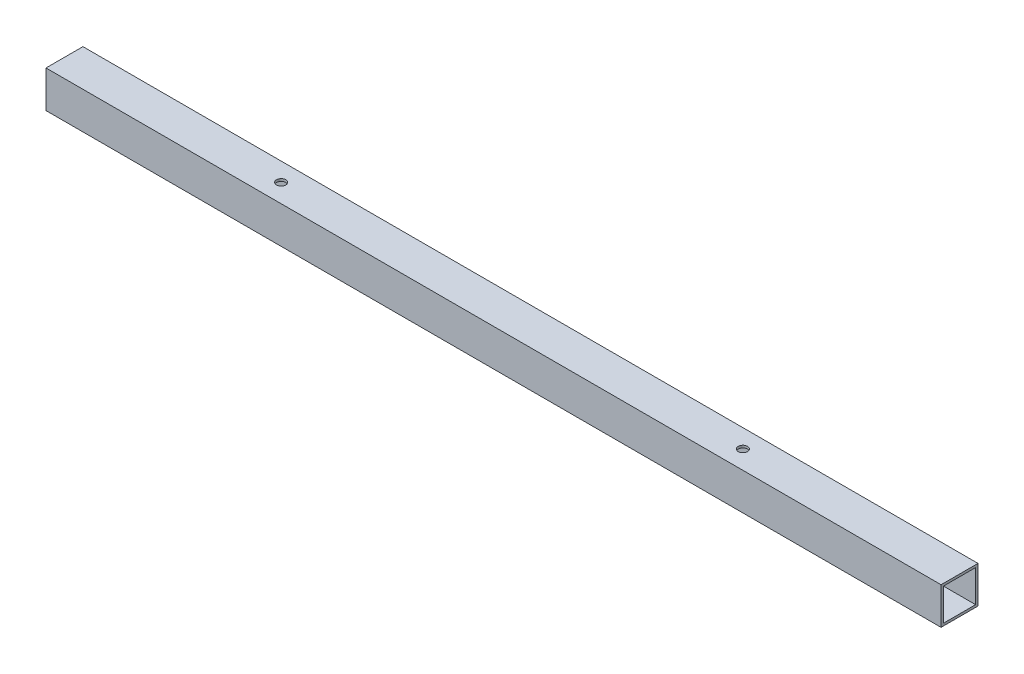
ISO-10303-21;
HEADER;
FILE_DESCRIPTION(('STEP AP214'),'2;1');
FILE_NAME('part.step','',(''),(''),'','','');
FILE_SCHEMA(('AUTOMOTIVE_DESIGN { 1 0 10303 214 1 1 1 1 }'));
ENDSEC;
DATA;
#1=APPLICATION_CONTEXT('core data for automotive mechanical design processes');
#2=APPLICATION_PROTOCOL_DEFINITION('international standard','automotive_design',2000,#1);
#3=PRODUCT_CONTEXT('',#1,'mechanical');
#4=PRODUCT('Part','Part','',(#3));
#5=PRODUCT_RELATED_PRODUCT_CATEGORY('part','',(#4));
#6=PRODUCT_DEFINITION_FORMATION('','',#4);
#7=PRODUCT_DEFINITION_CONTEXT('part definition',#1,'design');
#8=PRODUCT_DEFINITION('design','',#6,#7);
#9=PRODUCT_DEFINITION_SHAPE('','',#8);
#10=(LENGTH_UNIT() NAMED_UNIT(*) SI_UNIT(.MILLI.,.METRE.));
#11=(NAMED_UNIT(*) PLANE_ANGLE_UNIT() SI_UNIT($,.RADIAN.));
#12=(NAMED_UNIT(*) SI_UNIT($,.STERADIAN.) SOLID_ANGLE_UNIT());
#13=UNCERTAINTY_MEASURE_WITH_UNIT(LENGTH_MEASURE(1.E-05),#10,'distance_accuracy_value','');
#14=(GEOMETRIC_REPRESENTATION_CONTEXT(3) GLOBAL_UNCERTAINTY_ASSIGNED_CONTEXT((#13)) GLOBAL_UNIT_ASSIGNED_CONTEXT((#10,
#11,#12)) REPRESENTATION_CONTEXT('',''));
#15=CARTESIAN_POINT('',(0.,0.,0.));
#16=DIRECTION('',(0.,0.,1.));
#17=DIRECTION('',(1.,0.,0.));
#18=AXIS2_PLACEMENT_3D('',#15,#16,#17);
#19=CARTESIAN_POINT('',(615.4,12.7,-12.7));
#20=DIRECTION('',(0.,0.,1.));
#21=DIRECTION('',(1.,0.,0.));
#22=AXIS2_PLACEMENT_3D('',#19,#20,#21);
#23=PLANE('',#22);
#24=DIRECTION('',(0.,1.,0.));
#25=VECTOR('',#24,1.);
#26=CARTESIAN_POINT('',(0.,12.7,-12.7));
#27=LINE('',#26,#25);
#28=CARTESIAN_POINT('',(0.,-12.7,-12.7));
#29=VERTEX_POINT('',#28);
#30=CARTESIAN_POINT('',(0.,12.7,-12.7));
#31=VERTEX_POINT('',#30);
#32=EDGE_CURVE('E165',#29,#31,#27,.T.);
#33=ORIENTED_EDGE('',*,*,#32,.T.);
#34=DIRECTION('',(-1.,0.,0.));
#35=VECTOR('',#34,1.);
#36=CARTESIAN_POINT('',(615.4,12.7,-12.7));
#37=LINE('',#36,#35);
#38=CARTESIAN_POINT('',(615.4,12.7,-12.7));
#39=VERTEX_POINT('',#38);
#40=EDGE_CURVE('E12',#39,#31,#37,.T.);
#41=ORIENTED_EDGE('',*,*,#40,.F.);
#42=DIRECTION('',(0.,1.,0.));
#43=VECTOR('',#42,1.);
#44=CARTESIAN_POINT('',(615.4,12.7,-12.7));
#45=LINE('',#44,#43);
#46=CARTESIAN_POINT('',(615.4,-12.7,-12.7));
#47=VERTEX_POINT('',#46);
#48=EDGE_CURVE('E138',#47,#39,#45,.T.);
#49=ORIENTED_EDGE('',*,*,#48,.F.);
#50=DIRECTION('',(-1.,0.,0.));
#51=VECTOR('',#50,1.);
#52=CARTESIAN_POINT('',(615.4,-12.7,-12.7));
#53=LINE('',#52,#51);
#54=EDGE_CURVE('E172',#47,#29,#53,.T.);
#55=ORIENTED_EDGE('',*,*,#54,.T.);
#56=EDGE_LOOP('',(#33,#41,#49,#55));
#57=FACE_BOUND('',#56,.T.);
#58=ADVANCED_FACE('F57',(#57),#23,.F.);
#59=CARTESIAN_POINT('',(615.4,12.7,-12.7));
#60=DIRECTION('',(0.,-1.,0.));
#61=DIRECTION('',(0.,0.,-1.));
#62=AXIS2_PLACEMENT_3D('',#59,#60,#61);
#63=PLANE('',#62);
#64=CARTESIAN_POINT('',(148.95,12.7,0.));
#65=DIRECTION('',(0.,1.,0.));
#66=DIRECTION('',(0.,0.,1.));
#67=AXIS2_PLACEMENT_3D('',#64,#65,#66);
#68=CIRCLE('',#67,3.17499999999998);
#69=CARTESIAN_POINT('',(148.95,12.7,3.17499999999998));
#70=VERTEX_POINT('',#69);
#71=EDGE_CURVE('E225',#70,#70,#68,.T.);
#72=ORIENTED_EDGE('',*,*,#71,.F.);
#73=EDGE_LOOP('',(#72));
#74=FACE_BOUND('',#73,.T.);
#75=CARTESIAN_POINT('',(466.45,12.7,0.));
#76=DIRECTION('',(0.,1.,0.));
#77=DIRECTION('',(0.,0.,1.));
#78=AXIS2_PLACEMENT_3D('',#75,#76,#77);
#79=CIRCLE('',#78,3.17499999999998);
#80=CARTESIAN_POINT('',(466.45,12.7,3.17499999999994));
#81=VERTEX_POINT('',#80);
#82=EDGE_CURVE('E213',#81,#81,#79,.T.);
#83=ORIENTED_EDGE('',*,*,#82,.F.);
#84=EDGE_LOOP('',(#83));
#85=FACE_BOUND('',#84,.T.);
#86=DIRECTION('',(0.,0.,1.));
#87=VECTOR('',#86,1.);
#88=CARTESIAN_POINT('',(0.,12.7,-12.7));
#89=LINE('',#88,#87);
#90=CARTESIAN_POINT('',(0.,12.7,12.7));
#91=VERTEX_POINT('',#90);
#92=EDGE_CURVE('E143',#31,#91,#89,.T.);
#93=ORIENTED_EDGE('',*,*,#92,.T.);
#94=DIRECTION('',(-1.,0.,0.));
#95=VECTOR('',#94,1.);
#96=CARTESIAN_POINT('',(615.4,12.7,12.7));
#97=LINE('',#96,#95);
#98=CARTESIAN_POINT('',(615.4,12.7,12.7));
#99=VERTEX_POINT('',#98);
#100=EDGE_CURVE('E67',#99,#91,#97,.T.);
#101=ORIENTED_EDGE('',*,*,#100,.F.);
#102=DIRECTION('',(0.,0.,1.));
#103=VECTOR('',#102,1.);
#104=CARTESIAN_POINT('',(615.4,12.7,-12.7));
#105=LINE('',#104,#103);
#106=EDGE_CURVE('E132',#39,#99,#105,.T.);
#107=ORIENTED_EDGE('',*,*,#106,.F.);
#108=ORIENTED_EDGE('',*,*,#40,.T.);
#109=EDGE_LOOP('',(#93,#101,#107,#108));
#110=FACE_BOUND('',#109,.T.);
#111=ADVANCED_FACE('F142',(#74,#85,#110),#63,.F.);
#112=CARTESIAN_POINT('',(615.4,-12.7,12.7));
#113=DIRECTION('',(0.,0.,-1.));
#114=DIRECTION('',(0.,1.,0.));
#115=AXIS2_PLACEMENT_3D('',#112,#113,#114);
#116=PLANE('',#115);
#117=DIRECTION('',(0.,-1.,0.));
#118=VECTOR('',#117,1.);
#119=CARTESIAN_POINT('',(0.,-12.7,12.7));
#120=LINE('',#119,#118);
#121=CARTESIAN_POINT('',(0.,-12.7,12.7));
#122=VERTEX_POINT('',#121);
#123=EDGE_CURVE('E105',#91,#122,#120,.T.);
#124=ORIENTED_EDGE('',*,*,#123,.T.);
#125=DIRECTION('',(-1.,0.,0.));
#126=VECTOR('',#125,1.);
#127=CARTESIAN_POINT('',(615.4,-12.7,12.7));
#128=LINE('',#127,#126);
#129=CARTESIAN_POINT('',(615.4,-12.7,12.7));
#130=VERTEX_POINT('',#129);
#131=EDGE_CURVE('E144',#130,#122,#128,.T.);
#132=ORIENTED_EDGE('',*,*,#131,.F.);
#133=DIRECTION('',(0.,-1.,0.));
#134=VECTOR('',#133,1.);
#135=CARTESIAN_POINT('',(615.4,-12.7,12.7));
#136=LINE('',#135,#134);
#137=EDGE_CURVE('E136',#99,#130,#136,.T.);
#138=ORIENTED_EDGE('',*,*,#137,.F.);
#139=ORIENTED_EDGE('',*,*,#100,.T.);
#140=EDGE_LOOP('',(#124,#132,#138,#139));
#141=FACE_BOUND('',#140,.T.);
#142=ADVANCED_FACE('F146',(#141),#116,.F.);
#143=CARTESIAN_POINT('',(615.4,11.049,-11.049));
#144=DIRECTION('',(0.,-1.,0.));
#145=DIRECTION('',(0.,0.,-1.));
#146=AXIS2_PLACEMENT_3D('',#143,#144,#145);
#147=PLANE('',#146);
#148=CARTESIAN_POINT('',(148.95,11.049,0.));
#149=DIRECTION('',(0.,-1.,0.));
#150=DIRECTION('',(0.,0.,-1.));
#151=AXIS2_PLACEMENT_3D('',#148,#149,#150);
#152=CIRCLE('',#151,3.17499999999998);
#153=CARTESIAN_POINT('',(148.95,11.049,-3.17499999999998));
#154=VERTEX_POINT('',#153);
#155=EDGE_CURVE('E216',#154,#154,#152,.T.);
#156=ORIENTED_EDGE('',*,*,#155,.F.);
#157=EDGE_LOOP('',(#156));
#158=FACE_BOUND('',#157,.T.);
#159=CARTESIAN_POINT('',(466.45,11.049,0.));
#160=DIRECTION('',(0.,-1.,0.));
#161=DIRECTION('',(0.,0.,-1.));
#162=AXIS2_PLACEMENT_3D('',#159,#160,#161);
#163=CIRCLE('',#162,3.17499999999998);
#164=CARTESIAN_POINT('',(466.45,11.049,-3.17500000000002));
#165=VERTEX_POINT('',#164);
#166=EDGE_CURVE('E207',#165,#165,#163,.T.);
#167=ORIENTED_EDGE('',*,*,#166,.F.);
#168=EDGE_LOOP('',(#167));
#169=FACE_BOUND('',#168,.T.);
#170=DIRECTION('',(0.,0.,1.));
#171=VECTOR('',#170,1.);
#172=CARTESIAN_POINT('',(0.,11.049,-11.049));
#173=LINE('',#172,#171);
#174=CARTESIAN_POINT('',(0.,11.049,-11.049));
#175=VERTEX_POINT('',#174);
#176=CARTESIAN_POINT('',(0.,11.049,11.049));
#177=VERTEX_POINT('',#176);
#178=EDGE_CURVE('E152',#175,#177,#173,.T.);
#179=ORIENTED_EDGE('',*,*,#178,.F.);
#180=DIRECTION('',(-1.,0.,0.));
#181=VECTOR('',#180,1.);
#182=CARTESIAN_POINT('',(615.4,11.049,-11.049));
#183=LINE('',#182,#181);
#184=CARTESIAN_POINT('',(615.4,11.049,-11.049));
#185=VERTEX_POINT('',#184);
#186=EDGE_CURVE('E61',#185,#175,#183,.T.);
#187=ORIENTED_EDGE('',*,*,#186,.F.);
#188=DIRECTION('',(0.,0.,1.));
#189=VECTOR('',#188,1.);
#190=CARTESIAN_POINT('',(615.4,11.049,-11.049));
#191=LINE('',#190,#189);
#192=CARTESIAN_POINT('',(615.4,11.049,11.049));
#193=VERTEX_POINT('',#192);
#194=EDGE_CURVE('E171',#185,#193,#191,.T.);
#195=ORIENTED_EDGE('',*,*,#194,.T.);
#196=DIRECTION('',(-1.,0.,0.));
#197=VECTOR('',#196,1.);
#198=CARTESIAN_POINT('',(615.4,11.049,11.049));
#199=LINE('',#198,#197);
#200=EDGE_CURVE('E148',#193,#177,#199,.T.);
#201=ORIENTED_EDGE('',*,*,#200,.T.);
#202=EDGE_LOOP('',(#179,#187,#195,#201));
#203=FACE_BOUND('',#202,.T.);
#204=ADVANCED_FACE('F59',(#158,#169,#203),#147,.T.);
#205=CARTESIAN_POINT('',(615.4,11.049,-11.049));
#206=DIRECTION('',(0.,0.,1.));
#207=DIRECTION('',(1.,0.,0.));
#208=AXIS2_PLACEMENT_3D('',#205,#206,#207);
#209=PLANE('',#208);
#210=DIRECTION('',(0.,1.,0.));
#211=VECTOR('',#210,1.);
#212=CARTESIAN_POINT('',(0.,11.049,-11.049));
#213=LINE('',#212,#211);
#214=CARTESIAN_POINT('',(0.,-11.049,-11.049));
#215=VERTEX_POINT('',#214);
#216=EDGE_CURVE('E155',#215,#175,#213,.T.);
#217=ORIENTED_EDGE('',*,*,#216,.F.);
#218=DIRECTION('',(-1.,0.,0.));
#219=VECTOR('',#218,1.);
#220=CARTESIAN_POINT('',(615.4,-11.049,-11.049));
#221=LINE('',#220,#219);
#222=CARTESIAN_POINT('',(615.4,-11.049,-11.049));
#223=VERTEX_POINT('',#222);
#224=EDGE_CURVE('E177',#223,#215,#221,.T.);
#225=ORIENTED_EDGE('',*,*,#224,.F.);
#226=DIRECTION('',(0.,1.,0.));
#227=VECTOR('',#226,1.);
#228=CARTESIAN_POINT('',(615.4,11.049,-11.049));
#229=LINE('',#228,#227);
#230=EDGE_CURVE('E186',#223,#185,#229,.T.);
#231=ORIENTED_EDGE('',*,*,#230,.T.);
#232=ORIENTED_EDGE('',*,*,#186,.T.);
#233=EDGE_LOOP('',(#217,#225,#231,#232));
#234=FACE_BOUND('',#233,.T.);
#235=ADVANCED_FACE('F184',(#234),#209,.T.);
#236=CARTESIAN_POINT('',(615.4,-11.049,11.049));
#237=DIRECTION('',(0.,1.,0.));
#238=DIRECTION('',(0.,0.,1.));
#239=AXIS2_PLACEMENT_3D('',#236,#237,#238);
#240=PLANE('',#239);
#241=CARTESIAN_POINT('',(148.95,-11.049,0.));
#242=DIRECTION('',(0.,1.,0.));
#243=DIRECTION('',(0.,0.,1.));
#244=AXIS2_PLACEMENT_3D('',#241,#242,#243);
#245=CIRCLE('',#244,3.17499999999998);
#246=CARTESIAN_POINT('',(148.95,-11.049,3.17499999999998));
#247=VERTEX_POINT('',#246);
#248=EDGE_CURVE('E219',#247,#247,#245,.T.);
#249=ORIENTED_EDGE('',*,*,#248,.F.);
#250=EDGE_LOOP('',(#249));
#251=FACE_BOUND('',#250,.T.);
#252=CARTESIAN_POINT('',(466.45,-11.049,0.));
#253=DIRECTION('',(0.,1.,0.));
#254=DIRECTION('',(0.,0.,1.));
#255=AXIS2_PLACEMENT_3D('',#252,#253,#254);
#256=CIRCLE('',#255,3.17499999999998);
#257=CARTESIAN_POINT('',(466.45,-11.049,3.17499999999994));
#258=VERTEX_POINT('',#257);
#259=EDGE_CURVE('E156',#258,#258,#256,.T.);
#260=ORIENTED_EDGE('',*,*,#259,.F.);
#261=EDGE_LOOP('',(#260));
#262=FACE_BOUND('',#261,.T.);
#263=DIRECTION('',(0.,0.,-1.));
#264=VECTOR('',#263,1.);
#265=CARTESIAN_POINT('',(0.,-11.049,11.049));
#266=LINE('',#265,#264);
#267=CARTESIAN_POINT('',(0.,-11.049,11.049));
#268=VERTEX_POINT('',#267);
#269=EDGE_CURVE('E159',#268,#215,#266,.T.);
#270=ORIENTED_EDGE('',*,*,#269,.F.);
#271=DIRECTION('',(-1.,0.,0.));
#272=VECTOR('',#271,1.);
#273=CARTESIAN_POINT('',(615.4,-11.049,11.049));
#274=LINE('',#273,#272);
#275=CARTESIAN_POINT('',(615.4,-11.049,11.049));
#276=VERTEX_POINT('',#275);
#277=EDGE_CURVE('E176',#276,#268,#274,.T.);
#278=ORIENTED_EDGE('',*,*,#277,.F.);
#279=DIRECTION('',(0.,0.,-1.));
#280=VECTOR('',#279,1.);
#281=CARTESIAN_POINT('',(615.4,-11.049,11.049));
#282=LINE('',#281,#280);
#283=EDGE_CURVE('E193',#276,#223,#282,.T.);
#284=ORIENTED_EDGE('',*,*,#283,.T.);
#285=ORIENTED_EDGE('',*,*,#224,.T.);
#286=EDGE_LOOP('',(#270,#278,#284,#285));
#287=FACE_BOUND('',#286,.T.);
#288=ADVANCED_FACE('F191',(#251,#262,#287),#240,.T.);
#289=CARTESIAN_POINT('',(615.4,-11.049,11.049));
#290=DIRECTION('',(0.,0.,-1.));
#291=DIRECTION('',(-1.,0.,0.));
#292=AXIS2_PLACEMENT_3D('',#289,#290,#291);
#293=PLANE('',#292);
#294=DIRECTION('',(0.,-1.,0.));
#295=VECTOR('',#294,1.);
#296=CARTESIAN_POINT('',(0.,-11.049,11.049));
#297=LINE('',#296,#295);
#298=EDGE_CURVE('E162',#177,#268,#297,.T.);
#299=ORIENTED_EDGE('',*,*,#298,.F.);
#300=ORIENTED_EDGE('',*,*,#200,.F.);
#301=DIRECTION('',(0.,-1.,0.));
#302=VECTOR('',#301,1.);
#303=CARTESIAN_POINT('',(615.4,-11.049,11.049));
#304=LINE('',#303,#302);
#305=EDGE_CURVE('E198',#193,#276,#304,.T.);
#306=ORIENTED_EDGE('',*,*,#305,.T.);
#307=ORIENTED_EDGE('',*,*,#277,.T.);
#308=EDGE_LOOP('',(#299,#300,#306,#307));
#309=FACE_BOUND('',#308,.T.);
#310=ADVANCED_FACE('F200',(#309),#293,.T.);
#311=CARTESIAN_POINT('',(615.4,-12.7,12.7));
#312=DIRECTION('',(0.,1.,0.));
#313=DIRECTION('',(0.,0.,1.));
#314=AXIS2_PLACEMENT_3D('',#311,#312,#313);
#315=PLANE('',#314);
#316=CARTESIAN_POINT('',(148.95,-12.7,0.));
#317=DIRECTION('',(0.,1.,0.));
#318=DIRECTION('',(0.,0.,1.));
#319=AXIS2_PLACEMENT_3D('',#316,#317,#318);
#320=CIRCLE('',#319,3.17499999999998);
#321=CARTESIAN_POINT('',(148.95,-12.7,3.17499999999998));
#322=VERTEX_POINT('',#321);
#323=EDGE_CURVE('E222',#322,#322,#320,.T.);
#324=ORIENTED_EDGE('',*,*,#323,.T.);
#325=EDGE_LOOP('',(#324));
#326=FACE_BOUND('',#325,.T.);
#327=CARTESIAN_POINT('',(466.45,-12.7,0.));
#328=DIRECTION('',(0.,1.,0.));
#329=DIRECTION('',(0.,0.,1.));
#330=AXIS2_PLACEMENT_3D('',#327,#328,#329);
#331=CIRCLE('',#330,3.17499999999998);
#332=CARTESIAN_POINT('',(466.45,-12.7,3.17499999999994));
#333=VERTEX_POINT('',#332);
#334=EDGE_CURVE('E210',#333,#333,#331,.T.);
#335=ORIENTED_EDGE('',*,*,#334,.T.);
#336=EDGE_LOOP('',(#335));
#337=FACE_BOUND('',#336,.T.);
#338=DIRECTION('',(0.,0.,-1.));
#339=VECTOR('',#338,1.);
#340=CARTESIAN_POINT('',(0.,-12.7,12.7));
#341=LINE('',#340,#339);
#342=EDGE_CURVE('E111',#122,#29,#341,.T.);
#343=ORIENTED_EDGE('',*,*,#342,.T.);
#344=ORIENTED_EDGE('',*,*,#54,.F.);
#345=DIRECTION('',(0.,0.,-1.));
#346=VECTOR('',#345,1.);
#347=CARTESIAN_POINT('',(615.4,-12.7,12.7));
#348=LINE('',#347,#346);
#349=EDGE_CURVE('E76',#130,#47,#348,.T.);
#350=ORIENTED_EDGE('',*,*,#349,.F.);
#351=ORIENTED_EDGE('',*,*,#131,.T.);
#352=EDGE_LOOP('',(#343,#344,#350,#351));
#353=FACE_BOUND('',#352,.T.);
#354=ADVANCED_FACE('F260',(#326,#337,#353),#315,.F.);
#355=CARTESIAN_POINT('',(615.4,0.,0.));
#356=DIRECTION('',(1.,0.,0.));
#357=DIRECTION('',(0.,0.,-1.));
#358=AXIS2_PLACEMENT_3D('',#355,#356,#357);
#359=PLANE('',#358);
#360=ORIENTED_EDGE('',*,*,#194,.F.);
#361=ORIENTED_EDGE('',*,*,#230,.F.);
#362=ORIENTED_EDGE('',*,*,#283,.F.);
#363=ORIENTED_EDGE('',*,*,#305,.F.);
#364=EDGE_LOOP('',(#360,#361,#362,#363));
#365=FACE_BOUND('',#364,.T.);
#366=ORIENTED_EDGE('',*,*,#48,.T.);
#367=ORIENTED_EDGE('',*,*,#106,.T.);
#368=ORIENTED_EDGE('',*,*,#137,.T.);
#369=ORIENTED_EDGE('',*,*,#349,.T.);
#370=EDGE_LOOP('',(#366,#367,#368,#369));
#371=FACE_BOUND('',#370,.T.);
#372=ADVANCED_FACE('F134',(#365,#371),#359,.T.);
#373=CARTESIAN_POINT('',(0.,0.,0.));
#374=DIRECTION('',(1.,0.,0.));
#375=DIRECTION('',(0.,0.,-1.));
#376=AXIS2_PLACEMENT_3D('',#373,#374,#375);
#377=PLANE('',#376);
#378=ORIENTED_EDGE('',*,*,#178,.T.);
#379=ORIENTED_EDGE('',*,*,#298,.T.);
#380=ORIENTED_EDGE('',*,*,#269,.T.);
#381=ORIENTED_EDGE('',*,*,#216,.T.);
#382=EDGE_LOOP('',(#378,#379,#380,#381));
#383=FACE_BOUND('',#382,.T.);
#384=ORIENTED_EDGE('',*,*,#32,.F.);
#385=ORIENTED_EDGE('',*,*,#342,.F.);
#386=ORIENTED_EDGE('',*,*,#123,.F.);
#387=ORIENTED_EDGE('',*,*,#92,.F.);
#388=EDGE_LOOP('',(#384,#385,#386,#387));
#389=FACE_BOUND('',#388,.T.);
#390=ADVANCED_FACE('F189',(#383,#389),#377,.F.);
#391=CARTESIAN_POINT('',(466.45,12.7,0.));
#392=DIRECTION('',(0.,1.,0.));
#393=DIRECTION('',(0.,0.,1.));
#394=AXIS2_PLACEMENT_3D('',#391,#392,#393);
#395=CYLINDRICAL_SURFACE('',#394,3.17499999999998);
#396=ORIENTED_EDGE('',*,*,#259,.T.);
#397=EDGE_LOOP('',(#396));
#398=FACE_BOUND('',#397,.T.);
#399=ORIENTED_EDGE('',*,*,#334,.F.);
#400=EDGE_LOOP('',(#399));
#401=FACE_BOUND('',#400,.T.);
#402=ADVANCED_FACE('F239',(#398,#401),#395,.F.);
#403=ORIENTED_EDGE('',*,*,#166,.T.);
#404=EDGE_LOOP('',(#403));
#405=FACE_BOUND('',#404,.T.);
#406=ORIENTED_EDGE('',*,*,#82,.T.);
#407=EDGE_LOOP('',(#406));
#408=FACE_BOUND('',#407,.T.);
#409=ADVANCED_FACE('F236',(#405,#408),#395,.F.);
#410=CARTESIAN_POINT('',(148.95,12.7,0.));
#411=DIRECTION('',(0.,1.,0.));
#412=DIRECTION('',(0.,0.,1.));
#413=AXIS2_PLACEMENT_3D('',#410,#411,#412);
#414=CYLINDRICAL_SURFACE('',#413,3.17499999999998);
#415=ORIENTED_EDGE('',*,*,#248,.T.);
#416=EDGE_LOOP('',(#415));
#417=FACE_BOUND('',#416,.T.);
#418=ORIENTED_EDGE('',*,*,#323,.F.);
#419=EDGE_LOOP('',(#418));
#420=FACE_BOUND('',#419,.T.);
#421=ADVANCED_FACE('F238',(#417,#420),#414,.F.);
#422=ORIENTED_EDGE('',*,*,#155,.T.);
#423=EDGE_LOOP('',(#422));
#424=FACE_BOUND('',#423,.T.);
#425=ORIENTED_EDGE('',*,*,#71,.T.);
#426=EDGE_LOOP('',(#425));
#427=FACE_BOUND('',#426,.T.);
#428=ADVANCED_FACE('F229',(#424,#427),#414,.F.);
#429=CLOSED_SHELL('',(#58,#111,#142,#204,#235,#288,#310,#354,#372,#390,#402,#409,#421,#428));
#430=MANIFOLD_SOLID_BREP('B2',#429);
#431=ADVANCED_BREP_SHAPE_REPRESENTATION('',(#18,#430),#14);
#432=SHAPE_DEFINITION_REPRESENTATION(#9,#431);
ENDSEC;
END-ISO-10303-21;
